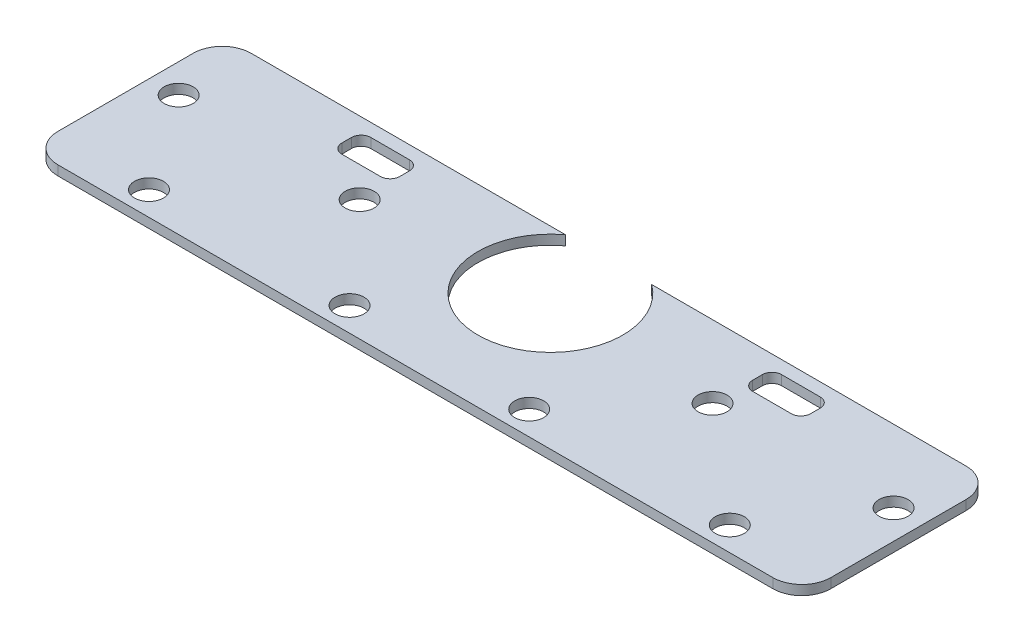
ISO-10303-21;
HEADER;
FILE_DESCRIPTION(('STEP AP214'),'2;1');
FILE_NAME('part.step','',(''),(''),'','','');
FILE_SCHEMA(('AUTOMOTIVE_DESIGN { 1 0 10303 214 1 1 1 1 }'));
ENDSEC;
DATA;
#1=APPLICATION_CONTEXT('core data for automotive mechanical design processes');
#2=APPLICATION_PROTOCOL_DEFINITION('international standard','automotive_design',2000,#1);
#3=PRODUCT_CONTEXT('',#1,'mechanical');
#4=PRODUCT('Part','Part','',(#3));
#5=PRODUCT_RELATED_PRODUCT_CATEGORY('part','',(#4));
#6=PRODUCT_DEFINITION_FORMATION('','',#4);
#7=PRODUCT_DEFINITION_CONTEXT('part definition',#1,'design');
#8=PRODUCT_DEFINITION('design','',#6,#7);
#9=PRODUCT_DEFINITION_SHAPE('','',#8);
#10=(LENGTH_UNIT() NAMED_UNIT(*) SI_UNIT(.MILLI.,.METRE.));
#11=(NAMED_UNIT(*) PLANE_ANGLE_UNIT() SI_UNIT($,.RADIAN.));
#12=(NAMED_UNIT(*) SI_UNIT($,.STERADIAN.) SOLID_ANGLE_UNIT());
#13=UNCERTAINTY_MEASURE_WITH_UNIT(LENGTH_MEASURE(1.E-05),#10,'distance_accuracy_value','');
#14=(GEOMETRIC_REPRESENTATION_CONTEXT(3) GLOBAL_UNCERTAINTY_ASSIGNED_CONTEXT((#13)) GLOBAL_UNIT_ASSIGNED_CONTEXT((#10,
#11,#12)) REPRESENTATION_CONTEXT('',''));
#15=CARTESIAN_POINT('',(0.,0.,0.));
#16=DIRECTION('',(0.,0.,1.));
#17=DIRECTION('',(1.,0.,0.));
#18=AXIS2_PLACEMENT_3D('',#15,#16,#17);
#19=CARTESIAN_POINT('',(0.,10.,-86.4681076778909));
#20=DIRECTION('',(0.,0.,1.));
#21=DIRECTION('',(1.,0.,0.));
#22=AXIS2_PLACEMENT_3D('',#19,#20,#21);
#23=PLANE('',#22);
#24=DIRECTION('',(-1.,0.,0.));
#25=VECTOR('',#24,1.);
#26=CARTESIAN_POINT('',(0.,0.,-86.4681076778909));
#27=LINE('',#26,#25);
#28=CARTESIAN_POINT('',(232.623487933506,0.,-86.4681076778909));
#29=VERTEX_POINT('',#28);
#30=CARTESIAN_POINT('',(192.623487933506,0.,-86.4681076778909));
#31=VERTEX_POINT('',#30);
#32=EDGE_CURVE('E357',#29,#31,#27,.T.);
#33=ORIENTED_EDGE('',*,*,#32,.F.);
#34=DIRECTION('',(0.,-1.,0.));
#35=VECTOR('',#34,1.);
#36=CARTESIAN_POINT('',(232.623487933506,10.,-86.4681076778909));
#37=LINE('',#36,#35);
#38=CARTESIAN_POINT('',(232.623487933506,10.,-86.4681076778909));
#39=VERTEX_POINT('',#38);
#40=EDGE_CURVE('E11',#39,#29,#37,.T.);
#41=ORIENTED_EDGE('',*,*,#40,.F.);
#42=DIRECTION('',(-1.,0.,0.));
#43=VECTOR('',#42,1.);
#44=CARTESIAN_POINT('',(0.,10.,-86.4681076778909));
#45=LINE('',#44,#43);
#46=CARTESIAN_POINT('',(192.623487933506,10.,-86.4681076778909));
#47=VERTEX_POINT('',#46);
#48=EDGE_CURVE('E569',#39,#47,#45,.T.);
#49=ORIENTED_EDGE('',*,*,#48,.T.);
#50=DIRECTION('',(0.,-1.,0.));
#51=VECTOR('',#50,1.);
#52=CARTESIAN_POINT('',(192.623487933506,10.,-86.4681076778909));
#53=LINE('',#52,#51);
#54=EDGE_CURVE('E62',#47,#31,#53,.T.);
#55=ORIENTED_EDGE('',*,*,#54,.T.);
#56=EDGE_LOOP('',(#33,#41,#49,#55));
#57=FACE_BOUND('',#56,.T.);
#58=ADVANCED_FACE('F42',(#57),#23,.T.);
#59=CARTESIAN_POINT('',(232.623487933506,10.,-76.4681076778909));
#60=DIRECTION('',(0.,-1.,0.));
#61=DIRECTION('',(0.,0.,-1.));
#62=AXIS2_PLACEMENT_3D('',#59,#60,#61);
#63=CYLINDRICAL_SURFACE('',#62,10.);
#64=CARTESIAN_POINT('',(232.623487933506,0.,-76.4681076778909));
#65=DIRECTION('',(0.,1.,0.));
#66=DIRECTION('',(0.,0.,1.));
#67=AXIS2_PLACEMENT_3D('',#64,#65,#66);
#68=CIRCLE('',#67,10.);
#69=CARTESIAN_POINT('',(242.623487933506,0.,-76.4681076778909));
#70=VERTEX_POINT('',#69);
#71=EDGE_CURVE('E360',#29,#70,#68,.F.);
#72=ORIENTED_EDGE('',*,*,#71,.T.);
#73=DIRECTION('',(0.,-1.,0.));
#74=VECTOR('',#73,1.);
#75=CARTESIAN_POINT('',(242.623487933506,10.,-76.4681076778909));
#76=LINE('',#75,#74);
#77=CARTESIAN_POINT('',(242.623487933506,10.,-76.4681076778909));
#78=VERTEX_POINT('',#77);
#79=EDGE_CURVE('E53',#78,#70,#76,.T.);
#80=ORIENTED_EDGE('',*,*,#79,.F.);
#81=CARTESIAN_POINT('',(232.623487933506,10.,-76.4681076778909));
#82=DIRECTION('',(0.,1.,0.));
#83=DIRECTION('',(0.,0.,1.));
#84=AXIS2_PLACEMENT_3D('',#81,#82,#83);
#85=CIRCLE('',#84,10.);
#86=EDGE_CURVE('E572',#39,#78,#85,.F.);
#87=ORIENTED_EDGE('',*,*,#86,.F.);
#88=ORIENTED_EDGE('',*,*,#40,.T.);
#89=EDGE_LOOP('',(#72,#80,#87,#88));
#90=FACE_BOUND('',#89,.T.);
#91=ADVANCED_FACE('F606',(#90),#63,.F.);
#92=CARTESIAN_POINT('',(242.623487933506,10.,0.));
#93=DIRECTION('',(1.,0.,0.));
#94=DIRECTION('',(0.,0.,-1.));
#95=AXIS2_PLACEMENT_3D('',#92,#93,#94);
#96=PLANE('',#95);
#97=DIRECTION('',(0.,0.,1.));
#98=VECTOR('',#97,1.);
#99=CARTESIAN_POINT('',(242.623487933506,0.,0.));
#100=LINE('',#99,#98);
#101=CARTESIAN_POINT('',(242.623487933506,0.,-66.468107677891));
#102=VERTEX_POINT('',#101);
#103=EDGE_CURVE('E364',#70,#102,#100,.T.);
#104=ORIENTED_EDGE('',*,*,#103,.T.);
#105=DIRECTION('',(0.,-1.,0.));
#106=VECTOR('',#105,1.);
#107=CARTESIAN_POINT('',(242.623487933506,10.,-66.468107677891));
#108=LINE('',#107,#106);
#109=CARTESIAN_POINT('',(242.623487933506,10.,-66.468107677891));
#110=VERTEX_POINT('',#109);
#111=EDGE_CURVE('E396',#110,#102,#108,.T.);
#112=ORIENTED_EDGE('',*,*,#111,.F.);
#113=DIRECTION('',(0.,0.,1.));
#114=VECTOR('',#113,1.);
#115=CARTESIAN_POINT('',(242.623487933506,10.,0.));
#116=LINE('',#115,#114);
#117=EDGE_CURVE('E576',#78,#110,#116,.T.);
#118=ORIENTED_EDGE('',*,*,#117,.F.);
#119=ORIENTED_EDGE('',*,*,#79,.T.);
#120=EDGE_LOOP('',(#104,#112,#118,#119));
#121=FACE_BOUND('',#120,.T.);
#122=ADVANCED_FACE('F591',(#121),#96,.F.);
#123=CARTESIAN_POINT('',(232.623487933506,10.,-66.4681076778909));
#124=DIRECTION('',(0.,-1.,0.));
#125=DIRECTION('',(0.,0.,-1.));
#126=AXIS2_PLACEMENT_3D('',#123,#124,#125);
#127=CYLINDRICAL_SURFACE('',#126,10.);
#128=CARTESIAN_POINT('',(232.623487933506,0.,-66.4681076778909));
#129=DIRECTION('',(0.,1.,0.));
#130=DIRECTION('',(0.,0.,1.));
#131=AXIS2_PLACEMENT_3D('',#128,#129,#130);
#132=CIRCLE('',#131,10.);
#133=CARTESIAN_POINT('',(232.623487933506,0.,-56.4681076778909));
#134=VERTEX_POINT('',#133);
#135=EDGE_CURVE('E368',#134,#102,#132,.T.);
#136=ORIENTED_EDGE('',*,*,#135,.F.);
#137=DIRECTION('',(0.,-1.,0.));
#138=VECTOR('',#137,1.);
#139=CARTESIAN_POINT('',(232.623487933506,10.,-56.4681076778909));
#140=LINE('',#139,#138);
#141=CARTESIAN_POINT('',(232.623487933506,10.,-56.4681076778909));
#142=VERTEX_POINT('',#141);
#143=EDGE_CURVE('E393',#142,#134,#140,.T.);
#144=ORIENTED_EDGE('',*,*,#143,.F.);
#145=CARTESIAN_POINT('',(232.623487933506,10.,-66.4681076778909));
#146=DIRECTION('',(0.,1.,0.));
#147=DIRECTION('',(0.,0.,1.));
#148=AXIS2_PLACEMENT_3D('',#145,#146,#147);
#149=CIRCLE('',#148,10.);
#150=EDGE_CURVE('E579',#142,#110,#149,.T.);
#151=ORIENTED_EDGE('',*,*,#150,.T.);
#152=ORIENTED_EDGE('',*,*,#111,.T.);
#153=EDGE_LOOP('',(#136,#144,#151,#152));
#154=FACE_BOUND('',#153,.T.);
#155=ADVANCED_FACE('F586',(#154),#127,.F.);
#156=CARTESIAN_POINT('',(0.,10.,-56.4681076778909));
#157=DIRECTION('',(0.,0.,1.));
#158=DIRECTION('',(1.,0.,0.));
#159=AXIS2_PLACEMENT_3D('',#156,#157,#158);
#160=PLANE('',#159);
#161=DIRECTION('',(-1.,0.,0.));
#162=VECTOR('',#161,1.);
#163=CARTESIAN_POINT('',(0.,0.,-56.4681076778909));
#164=LINE('',#163,#162);
#165=CARTESIAN_POINT('',(192.623487933506,0.,-56.4681076778909));
#166=VERTEX_POINT('',#165);
#167=EDGE_CURVE('E372',#134,#166,#164,.T.);
#168=ORIENTED_EDGE('',*,*,#167,.T.);
#169=DIRECTION('',(0.,-1.,0.));
#170=VECTOR('',#169,1.);
#171=CARTESIAN_POINT('',(192.623487933506,10.,-56.4681076778909));
#172=LINE('',#171,#170);
#173=CARTESIAN_POINT('',(192.623487933506,10.,-56.4681076778909));
#174=VERTEX_POINT('',#173);
#175=EDGE_CURVE('E233',#174,#166,#172,.T.);
#176=ORIENTED_EDGE('',*,*,#175,.F.);
#177=DIRECTION('',(-1.,0.,0.));
#178=VECTOR('',#177,1.);
#179=CARTESIAN_POINT('',(0.,10.,-56.4681076778909));
#180=LINE('',#179,#178);
#181=EDGE_CURVE('E243',#142,#174,#180,.T.);
#182=ORIENTED_EDGE('',*,*,#181,.F.);
#183=ORIENTED_EDGE('',*,*,#143,.T.);
#184=EDGE_LOOP('',(#168,#176,#182,#183));
#185=FACE_BOUND('',#184,.T.);
#186=ADVANCED_FACE('F596',(#185),#160,.F.);
#187=CARTESIAN_POINT('',(192.623487933506,10.,-66.4681076778909));
#188=DIRECTION('',(0.,-1.,0.));
#189=DIRECTION('',(0.,0.,-1.));
#190=AXIS2_PLACEMENT_3D('',#187,#188,#189);
#191=CYLINDRICAL_SURFACE('',#190,10.);
#192=CARTESIAN_POINT('',(192.623487933506,0.,-66.4681076778909));
#193=DIRECTION('',(0.,1.,0.));
#194=DIRECTION('',(0.,0.,1.));
#195=AXIS2_PLACEMENT_3D('',#192,#193,#194);
#196=CIRCLE('',#195,10.);
#197=CARTESIAN_POINT('',(182.623487933506,0.,-66.4681076778909));
#198=VERTEX_POINT('',#197);
#199=EDGE_CURVE('E228',#198,#166,#196,.T.);
#200=ORIENTED_EDGE('',*,*,#199,.F.);
#201=DIRECTION('',(0.,-1.,0.));
#202=VECTOR('',#201,1.);
#203=CARTESIAN_POINT('',(182.623487933506,10.,-66.4681076778909));
#204=LINE('',#203,#202);
#205=CARTESIAN_POINT('',(182.623487933506,10.,-66.4681076778909));
#206=VERTEX_POINT('',#205);
#207=EDGE_CURVE('E223',#206,#198,#204,.T.);
#208=ORIENTED_EDGE('',*,*,#207,.F.);
#209=CARTESIAN_POINT('',(192.623487933506,10.,-66.4681076778909));
#210=DIRECTION('',(0.,1.,0.));
#211=DIRECTION('',(0.,0.,1.));
#212=AXIS2_PLACEMENT_3D('',#209,#210,#211);
#213=CIRCLE('',#212,10.);
#214=EDGE_CURVE('E226',#206,#174,#213,.T.);
#215=ORIENTED_EDGE('',*,*,#214,.T.);
#216=ORIENTED_EDGE('',*,*,#175,.T.);
#217=EDGE_LOOP('',(#200,#208,#215,#216));
#218=FACE_BOUND('',#217,.T.);
#219=ADVANCED_FACE('F225',(#218),#191,.F.);
#220=CARTESIAN_POINT('',(182.623487933506,10.,0.));
#221=DIRECTION('',(1.,0.,0.));
#222=DIRECTION('',(0.,0.,-1.));
#223=AXIS2_PLACEMENT_3D('',#220,#221,#222);
#224=PLANE('',#223);
#225=DIRECTION('',(0.,0.,1.));
#226=VECTOR('',#225,1.);
#227=CARTESIAN_POINT('',(182.623487933506,0.,0.));
#228=LINE('',#227,#226);
#229=CARTESIAN_POINT('',(182.623487933506,0.,-76.4681076778909));
#230=VERTEX_POINT('',#229);
#231=EDGE_CURVE('E378',#230,#198,#228,.T.);
#232=ORIENTED_EDGE('',*,*,#231,.F.);
#233=DIRECTION('',(0.,-1.,0.));
#234=VECTOR('',#233,1.);
#235=CARTESIAN_POINT('',(182.623487933506,10.,-76.4681076778909));
#236=LINE('',#235,#234);
#237=CARTESIAN_POINT('',(182.623487933506,10.,-76.4681076778909));
#238=VERTEX_POINT('',#237);
#239=EDGE_CURVE('E141',#238,#230,#236,.T.);
#240=ORIENTED_EDGE('',*,*,#239,.F.);
#241=DIRECTION('',(0.,0.,1.));
#242=VECTOR('',#241,1.);
#243=CARTESIAN_POINT('',(182.623487933506,10.,0.));
#244=LINE('',#243,#242);
#245=EDGE_CURVE('E240',#238,#206,#244,.T.);
#246=ORIENTED_EDGE('',*,*,#245,.T.);
#247=ORIENTED_EDGE('',*,*,#207,.T.);
#248=EDGE_LOOP('',(#232,#240,#246,#247));
#249=FACE_BOUND('',#248,.T.);
#250=ADVANCED_FACE('F247',(#249),#224,.T.);
#251=CARTESIAN_POINT('',(-232.623487933506,10.,-76.4681076778909));
#252=DIRECTION('',(0.,-1.,0.));
#253=DIRECTION('',(0.,0.,-1.));
#254=AXIS2_PLACEMENT_3D('',#251,#252,#253);
#255=CYLINDRICAL_SURFACE('',#254,10.);
#256=CARTESIAN_POINT('',(-232.623487933506,0.,-76.4681076778909));
#257=DIRECTION('',(0.,1.,0.));
#258=DIRECTION('',(0.,0.,1.));
#259=AXIS2_PLACEMENT_3D('',#256,#257,#258);
#260=CIRCLE('',#259,10.);
#261=CARTESIAN_POINT('',(-232.623487933506,0.,-86.4681076778909));
#262=VERTEX_POINT('',#261);
#263=CARTESIAN_POINT('',(-242.623487933506,0.,-76.4681076778909));
#264=VERTEX_POINT('',#263);
#265=EDGE_CURVE('E317',#262,#264,#260,.T.);
#266=ORIENTED_EDGE('',*,*,#265,.F.);
#267=DIRECTION('',(0.,-1.,0.));
#268=VECTOR('',#267,1.);
#269=CARTESIAN_POINT('',(-232.623487933506,10.,-86.4681076778909));
#270=LINE('',#269,#268);
#271=CARTESIAN_POINT('',(-232.623487933506,10.,-86.4681076778909));
#272=VERTEX_POINT('',#271);
#273=EDGE_CURVE('E388',#272,#262,#270,.T.);
#274=ORIENTED_EDGE('',*,*,#273,.F.);
#275=CARTESIAN_POINT('',(-232.623487933506,10.,-76.4681076778909));
#276=DIRECTION('',(0.,1.,0.));
#277=DIRECTION('',(0.,0.,1.));
#278=AXIS2_PLACEMENT_3D('',#275,#276,#277);
#279=CIRCLE('',#278,10.);
#280=CARTESIAN_POINT('',(-242.623487933506,10.,-76.4681076778909));
#281=VERTEX_POINT('',#280);
#282=EDGE_CURVE('E532',#272,#281,#279,.T.);
#283=ORIENTED_EDGE('',*,*,#282,.T.);
#284=DIRECTION('',(0.,-1.,0.));
#285=VECTOR('',#284,1.);
#286=CARTESIAN_POINT('',(-242.623487933506,10.,-76.4681076778909));
#287=LINE('',#286,#285);
#288=EDGE_CURVE('E402',#281,#264,#287,.T.);
#289=ORIENTED_EDGE('',*,*,#288,.T.);
#290=EDGE_LOOP('',(#266,#274,#283,#289));
#291=FACE_BOUND('',#290,.T.);
#292=ADVANCED_FACE('F651',(#291),#255,.F.);
#293=CARTESIAN_POINT('',(0.,10.,-86.4681076778909));
#294=DIRECTION('',(0.,0.,-1.));
#295=DIRECTION('',(-1.,0.,0.));
#296=AXIS2_PLACEMENT_3D('',#293,#294,#295);
#297=PLANE('',#296);
#298=DIRECTION('',(1.,0.,0.));
#299=VECTOR('',#298,1.);
#300=CARTESIAN_POINT('',(0.,0.,-86.4681076778909));
#301=LINE('',#300,#299);
#302=CARTESIAN_POINT('',(-192.623487933506,0.,-86.4681076778909));
#303=VERTEX_POINT('',#302);
#304=EDGE_CURVE('E321',#262,#303,#301,.T.);
#305=ORIENTED_EDGE('',*,*,#304,.T.);
#306=DIRECTION('',(0.,-1.,0.));
#307=VECTOR('',#306,1.);
#308=CARTESIAN_POINT('',(-192.623487933506,10.,-86.4681076778909));
#309=LINE('',#308,#307);
#310=CARTESIAN_POINT('',(-192.623487933506,10.,-86.4681076778909));
#311=VERTEX_POINT('',#310);
#312=EDGE_CURVE('E422',#311,#303,#309,.T.);
#313=ORIENTED_EDGE('',*,*,#312,.F.);
#314=DIRECTION('',(1.,0.,0.));
#315=VECTOR('',#314,1.);
#316=CARTESIAN_POINT('',(0.,10.,-86.4681076778909));
#317=LINE('',#316,#315);
#318=EDGE_CURVE('E535',#272,#311,#317,.T.);
#319=ORIENTED_EDGE('',*,*,#318,.F.);
#320=ORIENTED_EDGE('',*,*,#273,.T.);
#321=EDGE_LOOP('',(#305,#313,#319,#320));
#322=FACE_BOUND('',#321,.T.);
#323=ADVANCED_FACE('F647',(#322),#297,.F.);
#324=CARTESIAN_POINT('',(-192.623487933506,10.,-76.4681076778909));
#325=DIRECTION('',(0.,-1.,0.));
#326=DIRECTION('',(0.,0.,-1.));
#327=AXIS2_PLACEMENT_3D('',#324,#325,#326);
#328=CYLINDRICAL_SURFACE('',#327,10.);
#329=CARTESIAN_POINT('',(-192.623487933506,0.,-76.4681076778909));
#330=DIRECTION('',(0.,1.,0.));
#331=DIRECTION('',(0.,0.,1.));
#332=AXIS2_PLACEMENT_3D('',#329,#330,#331);
#333=CIRCLE('',#332,10.);
#334=CARTESIAN_POINT('',(-182.623487933506,0.,-76.4681076778909));
#335=VERTEX_POINT('',#334);
#336=EDGE_CURVE('E325',#303,#335,#333,.F.);
#337=ORIENTED_EDGE('',*,*,#336,.T.);
#338=DIRECTION('',(0.,-1.,0.));
#339=VECTOR('',#338,1.);
#340=CARTESIAN_POINT('',(-182.623487933506,10.,-76.4681076778909));
#341=LINE('',#340,#339);
#342=CARTESIAN_POINT('',(-182.623487933506,10.,-76.4681076778909));
#343=VERTEX_POINT('',#342);
#344=EDGE_CURVE('E418',#343,#335,#341,.T.);
#345=ORIENTED_EDGE('',*,*,#344,.F.);
#346=CARTESIAN_POINT('',(-192.623487933506,10.,-76.4681076778909));
#347=DIRECTION('',(0.,1.,0.));
#348=DIRECTION('',(0.,0.,1.));
#349=AXIS2_PLACEMENT_3D('',#346,#347,#348);
#350=CIRCLE('',#349,10.);
#351=EDGE_CURVE('E539',#311,#343,#350,.F.);
#352=ORIENTED_EDGE('',*,*,#351,.F.);
#353=ORIENTED_EDGE('',*,*,#312,.T.);
#354=EDGE_LOOP('',(#337,#345,#352,#353));
#355=FACE_BOUND('',#354,.T.);
#356=ADVANCED_FACE('F643',(#355),#328,.F.);
#357=CARTESIAN_POINT('',(-182.623487933506,10.,0.));
#358=DIRECTION('',(1.,0.,0.));
#359=DIRECTION('',(0.,0.,-1.));
#360=AXIS2_PLACEMENT_3D('',#357,#358,#359);
#361=PLANE('',#360);
#362=DIRECTION('',(0.,0.,1.));
#363=VECTOR('',#362,1.);
#364=CARTESIAN_POINT('',(-182.623487933506,0.,0.));
#365=LINE('',#364,#363);
#366=CARTESIAN_POINT('',(-182.623487933506,0.,-66.4681076778909));
#367=VERTEX_POINT('',#366);
#368=EDGE_CURVE('E329',#335,#367,#365,.T.);
#369=ORIENTED_EDGE('',*,*,#368,.T.);
#370=DIRECTION('',(0.,-1.,0.));
#371=VECTOR('',#370,1.);
#372=CARTESIAN_POINT('',(-182.623487933506,10.,-66.4681076778909));
#373=LINE('',#372,#371);
#374=CARTESIAN_POINT('',(-182.623487933506,10.,-66.4681076778909));
#375=VERTEX_POINT('',#374);
#376=EDGE_CURVE('E414',#375,#367,#373,.T.);
#377=ORIENTED_EDGE('',*,*,#376,.F.);
#378=DIRECTION('',(0.,0.,1.));
#379=VECTOR('',#378,1.);
#380=CARTESIAN_POINT('',(-182.623487933506,10.,0.));
#381=LINE('',#380,#379);
#382=EDGE_CURVE('E543',#343,#375,#381,.T.);
#383=ORIENTED_EDGE('',*,*,#382,.F.);
#384=ORIENTED_EDGE('',*,*,#344,.T.);
#385=EDGE_LOOP('',(#369,#377,#383,#384));
#386=FACE_BOUND('',#385,.T.);
#387=ADVANCED_FACE('F639',(#386),#361,.F.);
#388=CARTESIAN_POINT('',(-192.623487933506,10.,-66.4681076778909));
#389=DIRECTION('',(0.,-1.,0.));
#390=DIRECTION('',(0.,0.,-1.));
#391=AXIS2_PLACEMENT_3D('',#388,#389,#390);
#392=CYLINDRICAL_SURFACE('',#391,10.);
#393=CARTESIAN_POINT('',(-192.623487933506,0.,-66.4681076778909));
#394=DIRECTION('',(0.,1.,0.));
#395=DIRECTION('',(0.,0.,1.));
#396=AXIS2_PLACEMENT_3D('',#393,#394,#395);
#397=CIRCLE('',#396,10.);
#398=CARTESIAN_POINT('',(-192.623487933506,0.,-56.4681076778909));
#399=VERTEX_POINT('',#398);
#400=EDGE_CURVE('E333',#367,#399,#397,.F.);
#401=ORIENTED_EDGE('',*,*,#400,.T.);
#402=DIRECTION('',(0.,-1.,0.));
#403=VECTOR('',#402,1.);
#404=CARTESIAN_POINT('',(-192.623487933506,10.,-56.4681076778909));
#405=LINE('',#404,#403);
#406=CARTESIAN_POINT('',(-192.623487933506,10.,-56.4681076778909));
#407=VERTEX_POINT('',#406);
#408=EDGE_CURVE('E411',#407,#399,#405,.T.);
#409=ORIENTED_EDGE('',*,*,#408,.F.);
#410=CARTESIAN_POINT('',(-192.623487933506,10.,-66.4681076778909));
#411=DIRECTION('',(0.,1.,0.));
#412=DIRECTION('',(0.,0.,1.));
#413=AXIS2_PLACEMENT_3D('',#410,#411,#412);
#414=CIRCLE('',#413,10.);
#415=EDGE_CURVE('E547',#375,#407,#414,.F.);
#416=ORIENTED_EDGE('',*,*,#415,.F.);
#417=ORIENTED_EDGE('',*,*,#376,.T.);
#418=EDGE_LOOP('',(#401,#409,#416,#417));
#419=FACE_BOUND('',#418,.T.);
#420=ADVANCED_FACE('F635',(#419),#392,.F.);
#421=CARTESIAN_POINT('',(0.,10.,-56.4681076778909));
#422=DIRECTION('',(0.,0.,-1.));
#423=DIRECTION('',(-1.,0.,0.));
#424=AXIS2_PLACEMENT_3D('',#421,#422,#423);
#425=PLANE('',#424);
#426=DIRECTION('',(1.,0.,0.));
#427=VECTOR('',#426,1.);
#428=CARTESIAN_POINT('',(0.,0.,-56.4681076778909));
#429=LINE('',#428,#427);
#430=CARTESIAN_POINT('',(-232.623487933506,0.,-56.4681076778909));
#431=VERTEX_POINT('',#430);
#432=EDGE_CURVE('E337',#431,#399,#429,.T.);
#433=ORIENTED_EDGE('',*,*,#432,.F.);
#434=DIRECTION('',(0.,-1.,0.));
#435=VECTOR('',#434,1.);
#436=CARTESIAN_POINT('',(-232.623487933506,10.,-56.4681076778909));
#437=LINE('',#436,#435);
#438=CARTESIAN_POINT('',(-232.623487933506,10.,-56.4681076778909));
#439=VERTEX_POINT('',#438);
#440=EDGE_CURVE('E408',#439,#431,#437,.T.);
#441=ORIENTED_EDGE('',*,*,#440,.F.);
#442=DIRECTION('',(1.,0.,0.));
#443=VECTOR('',#442,1.);
#444=CARTESIAN_POINT('',(0.,10.,-56.4681076778909));
#445=LINE('',#444,#443);
#446=EDGE_CURVE('E550',#439,#407,#445,.T.);
#447=ORIENTED_EDGE('',*,*,#446,.T.);
#448=ORIENTED_EDGE('',*,*,#408,.T.);
#449=EDGE_LOOP('',(#433,#441,#447,#448));
#450=FACE_BOUND('',#449,.T.);
#451=ADVANCED_FACE('F631',(#450),#425,.T.);
#452=CARTESIAN_POINT('',(-232.623487933506,10.,-66.4681076778909));
#453=DIRECTION('',(0.,-1.,0.));
#454=DIRECTION('',(0.,0.,-1.));
#455=AXIS2_PLACEMENT_3D('',#452,#453,#454);
#456=CYLINDRICAL_SURFACE('',#455,10.);
#457=CARTESIAN_POINT('',(-232.623487933506,0.,-66.4681076778909));
#458=DIRECTION('',(0.,1.,0.));
#459=DIRECTION('',(0.,0.,1.));
#460=AXIS2_PLACEMENT_3D('',#457,#458,#459);
#461=CIRCLE('',#460,10.);
#462=CARTESIAN_POINT('',(-242.623487933506,0.,-66.468107677891));
#463=VERTEX_POINT('',#462);
#464=EDGE_CURVE('E341',#431,#463,#461,.F.);
#465=ORIENTED_EDGE('',*,*,#464,.T.);
#466=DIRECTION('',(0.,-1.,0.));
#467=VECTOR('',#466,1.);
#468=CARTESIAN_POINT('',(-242.623487933506,10.,-66.468107677891));
#469=LINE('',#468,#467);
#470=CARTESIAN_POINT('',(-242.623487933506,10.,-66.468107677891));
#471=VERTEX_POINT('',#470);
#472=EDGE_CURVE('E405',#471,#463,#469,.T.);
#473=ORIENTED_EDGE('',*,*,#472,.F.);
#474=CARTESIAN_POINT('',(-232.623487933506,10.,-66.4681076778909));
#475=DIRECTION('',(0.,1.,0.));
#476=DIRECTION('',(0.,0.,1.));
#477=AXIS2_PLACEMENT_3D('',#474,#475,#476);
#478=CIRCLE('',#477,10.);
#479=EDGE_CURVE('E554',#439,#471,#478,.F.);
#480=ORIENTED_EDGE('',*,*,#479,.F.);
#481=ORIENTED_EDGE('',*,*,#440,.T.);
#482=EDGE_LOOP('',(#465,#473,#480,#481));
#483=FACE_BOUND('',#482,.T.);
#484=ADVANCED_FACE('F628',(#483),#456,.F.);
#485=CARTESIAN_POINT('',(0.,10.,-39.7168436794864));
#486=DIRECTION('',(0.,-1.,0.));
#487=DIRECTION('',(0.,0.,-1.));
#488=AXIS2_PLACEMENT_3D('',#485,#486,#487);
#489=CYLINDRICAL_SURFACE('',#488,75.);
#490=CARTESIAN_POINT('',(0.,0.,-39.7168436794864));
#491=DIRECTION('',(0.,1.,0.));
#492=DIRECTION('',(0.,0.,1.));
#493=AXIS2_PLACEMENT_3D('',#490,#491,#492);
#494=CIRCLE('',#493,75.);
#495=CARTESIAN_POINT('',(-44.6199626180539,0.,-100.));
#496=VERTEX_POINT('',#495);
#497=CARTESIAN_POINT('',(44.6199626180539,0.,-100.));
#498=VERTEX_POINT('',#497);
#499=EDGE_CURVE('E280',#496,#498,#494,.T.);
#500=ORIENTED_EDGE('',*,*,#499,.F.);
#501=DIRECTION('',(0.,-1.,0.));
#502=VECTOR('',#501,1.);
#503=CARTESIAN_POINT('',(-44.6199626180539,10.,-100.));
#504=LINE('',#503,#502);
#505=CARTESIAN_POINT('',(-44.6199626180539,10.,-100.));
#506=VERTEX_POINT('',#505);
#507=EDGE_CURVE('E46',#506,#496,#504,.T.);
#508=ORIENTED_EDGE('',*,*,#507,.F.);
#509=CARTESIAN_POINT('',(0.,10.,-39.7168436794864));
#510=DIRECTION('',(0.,1.,0.));
#511=DIRECTION('',(0.,0.,1.));
#512=AXIS2_PLACEMENT_3D('',#509,#510,#511);
#513=CIRCLE('',#512,75.);
#514=CARTESIAN_POINT('',(44.6199626180539,10.,-100.));
#515=VERTEX_POINT('',#514);
#516=EDGE_CURVE('E470',#506,#515,#513,.T.);
#517=ORIENTED_EDGE('',*,*,#516,.T.);
#518=DIRECTION('',(0.,-1.,0.));
#519=VECTOR('',#518,1.);
#520=CARTESIAN_POINT('',(44.6199626180539,10.,-100.));
#521=LINE('',#520,#519);
#522=EDGE_CURVE('E252',#515,#498,#521,.T.);
#523=ORIENTED_EDGE('',*,*,#522,.T.);
#524=EDGE_LOOP('',(#500,#508,#517,#523));
#525=FACE_BOUND('',#524,.T.);
#526=ADVANCED_FACE('F467',(#525),#489,.F.);
#527=CARTESIAN_POINT('',(0.,10.,-100.));
#528=DIRECTION('',(0.,0.,1.));
#529=DIRECTION('',(1.,0.,0.));
#530=AXIS2_PLACEMENT_3D('',#527,#528,#529);
#531=PLANE('',#530);
#532=DIRECTION('',(-1.,0.,0.));
#533=VECTOR('',#532,1.);
#534=CARTESIAN_POINT('',(0.,0.,-100.));
#535=LINE('',#534,#533);
#536=CARTESIAN_POINT('',(-370.,0.,-99.9999999999999));
#537=VERTEX_POINT('',#536);
#538=EDGE_CURVE('E284',#496,#537,#535,.T.);
#539=ORIENTED_EDGE('',*,*,#538,.T.);
#540=DIRECTION('',(0.,-1.,0.));
#541=VECTOR('',#540,1.);
#542=CARTESIAN_POINT('',(-370.,10.,-99.9999999999999));
#543=LINE('',#542,#541);
#544=CARTESIAN_POINT('',(-370.,10.,-99.9999999999999));
#545=VERTEX_POINT('',#544);
#546=EDGE_CURVE('E452',#545,#537,#543,.T.);
#547=ORIENTED_EDGE('',*,*,#546,.F.);
#548=DIRECTION('',(-1.,0.,0.));
#549=VECTOR('',#548,1.);
#550=CARTESIAN_POINT('',(0.,10.,-100.));
#551=LINE('',#550,#549);
#552=EDGE_CURVE('E462',#506,#545,#551,.T.);
#553=ORIENTED_EDGE('',*,*,#552,.F.);
#554=ORIENTED_EDGE('',*,*,#507,.T.);
#555=EDGE_LOOP('',(#539,#547,#553,#554));
#556=FACE_BOUND('',#555,.T.);
#557=ADVANCED_FACE('F461',(#556),#531,.F.);
#558=CARTESIAN_POINT('',(-370.,10.,-70.));
#559=DIRECTION('',(0.,-1.,0.));
#560=DIRECTION('',(0.,0.,-1.));
#561=AXIS2_PLACEMENT_3D('',#558,#559,#560);
#562=CYLINDRICAL_SURFACE('',#561,30.);
#563=CARTESIAN_POINT('',(-370.,0.,-70.));
#564=DIRECTION('',(0.,1.,0.));
#565=DIRECTION('',(0.,0.,1.));
#566=AXIS2_PLACEMENT_3D('',#563,#564,#565);
#567=CIRCLE('',#566,30.);
#568=CARTESIAN_POINT('',(-400.,0.,-70.));
#569=VERTEX_POINT('',#568);
#570=EDGE_CURVE('E288',#569,#537,#567,.F.);
#571=ORIENTED_EDGE('',*,*,#570,.F.);
#572=DIRECTION('',(0.,-1.,0.));
#573=VECTOR('',#572,1.);
#574=CARTESIAN_POINT('',(-400.,10.,-70.));
#575=LINE('',#574,#573);
#576=CARTESIAN_POINT('',(-400.,10.,-70.));
#577=VERTEX_POINT('',#576);
#578=EDGE_CURVE('E450',#577,#569,#575,.T.);
#579=ORIENTED_EDGE('',*,*,#578,.F.);
#580=CARTESIAN_POINT('',(-370.,10.,-70.));
#581=DIRECTION('',(0.,1.,0.));
#582=DIRECTION('',(0.,0.,1.));
#583=AXIS2_PLACEMENT_3D('',#580,#581,#582);
#584=CIRCLE('',#583,30.);
#585=EDGE_CURVE('E502',#577,#545,#584,.F.);
#586=ORIENTED_EDGE('',*,*,#585,.T.);
#587=ORIENTED_EDGE('',*,*,#546,.T.);
#588=EDGE_LOOP('',(#571,#579,#586,#587));
#589=FACE_BOUND('',#588,.T.);
#590=ADVANCED_FACE('F681',(#589),#562,.T.);
#591=CARTESIAN_POINT('',(-400.,10.,1.58603289232165E-13));
#592=DIRECTION('',(-1.,0.,0.));
#593=DIRECTION('',(0.,0.,1.));
#594=AXIS2_PLACEMENT_3D('',#591,#592,#593);
#595=PLANE('',#594);
#596=DIRECTION('',(0.,0.,-1.));
#597=VECTOR('',#596,1.);
#598=CARTESIAN_POINT('',(-400.,0.,1.58603289232165E-13));
#599=LINE('',#598,#597);
#600=CARTESIAN_POINT('',(-400.,0.,70.0000000000001));
#601=VERTEX_POINT('',#600);
#602=EDGE_CURVE('E293',#601,#569,#599,.T.);
#603=ORIENTED_EDGE('',*,*,#602,.F.);
#604=DIRECTION('',(0.,-1.,0.));
#605=VECTOR('',#604,1.);
#606=CARTESIAN_POINT('',(-400.,10.,70.0000000000001));
#607=LINE('',#606,#605);
#608=CARTESIAN_POINT('',(-400.,10.,70.0000000000001));
#609=VERTEX_POINT('',#608);
#610=EDGE_CURVE('E447',#609,#601,#607,.T.);
#611=ORIENTED_EDGE('',*,*,#610,.F.);
#612=DIRECTION('',(0.,0.,-1.));
#613=VECTOR('',#612,1.);
#614=CARTESIAN_POINT('',(-400.,10.,1.58603289232165E-13));
#615=LINE('',#614,#613);
#616=EDGE_CURVE('E506',#609,#577,#615,.T.);
#617=ORIENTED_EDGE('',*,*,#616,.T.);
#618=ORIENTED_EDGE('',*,*,#578,.T.);
#619=EDGE_LOOP('',(#603,#611,#617,#618));
#620=FACE_BOUND('',#619,.T.);
#621=ADVANCED_FACE('F677',(#620),#595,.T.);
#622=CARTESIAN_POINT('',(-370.,10.,70.0000000000001));
#623=DIRECTION('',(0.,-1.,0.));
#624=DIRECTION('',(0.,0.,-1.));
#625=AXIS2_PLACEMENT_3D('',#622,#623,#624);
#626=CYLINDRICAL_SURFACE('',#625,30.);
#627=CARTESIAN_POINT('',(-370.,0.,70.0000000000001));
#628=DIRECTION('',(0.,1.,0.));
#629=DIRECTION('',(0.,0.,1.));
#630=AXIS2_PLACEMENT_3D('',#627,#628,#629);
#631=CIRCLE('',#630,30.);
#632=CARTESIAN_POINT('',(-370.,0.,100.));
#633=VERTEX_POINT('',#632);
#634=EDGE_CURVE('E297',#633,#601,#631,.F.);
#635=ORIENTED_EDGE('',*,*,#634,.F.);
#636=DIRECTION('',(0.,-1.,0.));
#637=VECTOR('',#636,1.);
#638=CARTESIAN_POINT('',(-370.,10.,100.));
#639=LINE('',#638,#637);
#640=CARTESIAN_POINT('',(-370.,10.,100.));
#641=VERTEX_POINT('',#640);
#642=EDGE_CURVE('E444',#641,#633,#639,.T.);
#643=ORIENTED_EDGE('',*,*,#642,.F.);
#644=CARTESIAN_POINT('',(-370.,10.,70.0000000000001));
#645=DIRECTION('',(0.,1.,0.));
#646=DIRECTION('',(0.,0.,1.));
#647=AXIS2_PLACEMENT_3D('',#644,#645,#646);
#648=CIRCLE('',#647,30.);
#649=EDGE_CURVE('E510',#641,#609,#648,.F.);
#650=ORIENTED_EDGE('',*,*,#649,.T.);
#651=ORIENTED_EDGE('',*,*,#610,.T.);
#652=EDGE_LOOP('',(#635,#643,#650,#651));
#653=FACE_BOUND('',#652,.T.);
#654=ADVANCED_FACE('F673',(#653),#626,.T.);
#655=CARTESIAN_POINT('',(0.,10.,100.));
#656=DIRECTION('',(0.,0.,1.));
#657=DIRECTION('',(1.,0.,0.));
#658=AXIS2_PLACEMENT_3D('',#655,#656,#657);
#659=PLANE('',#658);
#660=DIRECTION('',(-1.,0.,0.));
#661=VECTOR('',#660,1.);
#662=CARTESIAN_POINT('',(0.,0.,100.));
#663=LINE('',#662,#661);
#664=CARTESIAN_POINT('',(370.,0.,100.));
#665=VERTEX_POINT('',#664);
#666=EDGE_CURVE('E301',#665,#633,#663,.T.);
#667=ORIENTED_EDGE('',*,*,#666,.F.);
#668=DIRECTION('',(0.,-1.,0.));
#669=VECTOR('',#668,1.);
#670=CARTESIAN_POINT('',(370.,10.,100.));
#671=LINE('',#670,#669);
#672=CARTESIAN_POINT('',(370.,10.,100.));
#673=VERTEX_POINT('',#672);
#674=EDGE_CURVE('E441',#673,#665,#671,.T.);
#675=ORIENTED_EDGE('',*,*,#674,.F.);
#676=DIRECTION('',(-1.,0.,0.));
#677=VECTOR('',#676,1.);
#678=CARTESIAN_POINT('',(0.,10.,100.));
#679=LINE('',#678,#677);
#680=EDGE_CURVE('E514',#673,#641,#679,.T.);
#681=ORIENTED_EDGE('',*,*,#680,.T.);
#682=ORIENTED_EDGE('',*,*,#642,.T.);
#683=EDGE_LOOP('',(#667,#675,#681,#682));
#684=FACE_BOUND('',#683,.T.);
#685=ADVANCED_FACE('F669',(#684),#659,.T.);
#686=CARTESIAN_POINT('',(370.,10.,70.));
#687=DIRECTION('',(0.,-1.,0.));
#688=DIRECTION('',(0.,0.,-1.));
#689=AXIS2_PLACEMENT_3D('',#686,#687,#688);
#690=CYLINDRICAL_SURFACE('',#689,30.);
#691=CARTESIAN_POINT('',(370.,0.,70.));
#692=DIRECTION('',(0.,1.,0.));
#693=DIRECTION('',(0.,0.,1.));
#694=AXIS2_PLACEMENT_3D('',#691,#692,#693);
#695=CIRCLE('',#694,30.);
#696=CARTESIAN_POINT('',(400.,0.,70.));
#697=VERTEX_POINT('',#696);
#698=EDGE_CURVE('E305',#697,#665,#695,.F.);
#699=ORIENTED_EDGE('',*,*,#698,.F.);
#700=DIRECTION('',(0.,-1.,0.));
#701=VECTOR('',#700,1.);
#702=CARTESIAN_POINT('',(400.,10.,70.));
#703=LINE('',#702,#701);
#704=CARTESIAN_POINT('',(400.,10.,70.));
#705=VERTEX_POINT('',#704);
#706=EDGE_CURVE('E438',#705,#697,#703,.T.);
#707=ORIENTED_EDGE('',*,*,#706,.F.);
#708=CARTESIAN_POINT('',(370.,10.,70.));
#709=DIRECTION('',(0.,1.,0.));
#710=DIRECTION('',(0.,0.,1.));
#711=AXIS2_PLACEMENT_3D('',#708,#709,#710);
#712=CIRCLE('',#711,30.);
#713=EDGE_CURVE('E518',#705,#673,#712,.F.);
#714=ORIENTED_EDGE('',*,*,#713,.T.);
#715=ORIENTED_EDGE('',*,*,#674,.T.);
#716=EDGE_LOOP('',(#699,#707,#714,#715));
#717=FACE_BOUND('',#716,.T.);
#718=ADVANCED_FACE('F665',(#717),#690,.T.);
#719=CARTESIAN_POINT('',(400.,10.,1.58603289232165E-13));
#720=DIRECTION('',(-1.,0.,0.));
#721=DIRECTION('',(0.,0.,1.));
#722=AXIS2_PLACEMENT_3D('',#719,#720,#721);
#723=PLANE('',#722);
#724=DIRECTION('',(0.,0.,-1.));
#725=VECTOR('',#724,1.);
#726=CARTESIAN_POINT('',(400.,0.,1.58603289232165E-13));
#727=LINE('',#726,#725);
#728=CARTESIAN_POINT('',(400.,0.,-70.0000000000001));
#729=VERTEX_POINT('',#728);
#730=EDGE_CURVE('E309',#697,#729,#727,.T.);
#731=ORIENTED_EDGE('',*,*,#730,.T.);
#732=DIRECTION('',(0.,-1.,0.));
#733=VECTOR('',#732,1.);
#734=CARTESIAN_POINT('',(400.,10.,-70.0000000000001));
#735=LINE('',#734,#733);
#736=CARTESIAN_POINT('',(400.,10.,-70.0000000000001));
#737=VERTEX_POINT('',#736);
#738=EDGE_CURVE('E434',#737,#729,#735,.T.);
#739=ORIENTED_EDGE('',*,*,#738,.F.);
#740=DIRECTION('',(0.,0.,-1.));
#741=VECTOR('',#740,1.);
#742=CARTESIAN_POINT('',(400.,10.,1.58603289232165E-13));
#743=LINE('',#742,#741);
#744=EDGE_CURVE('E522',#705,#737,#743,.T.);
#745=ORIENTED_EDGE('',*,*,#744,.F.);
#746=ORIENTED_EDGE('',*,*,#706,.T.);
#747=EDGE_LOOP('',(#731,#739,#745,#746));
#748=FACE_BOUND('',#747,.T.);
#749=ADVANCED_FACE('F661',(#748),#723,.F.);
#750=CARTESIAN_POINT('',(370.,10.,-70.));
#751=DIRECTION('',(0.,-1.,0.));
#752=DIRECTION('',(0.,0.,-1.));
#753=AXIS2_PLACEMENT_3D('',#750,#751,#752);
#754=CYLINDRICAL_SURFACE('',#753,30.);
#755=CARTESIAN_POINT('',(370.,0.,-70.));
#756=DIRECTION('',(0.,1.,0.));
#757=DIRECTION('',(0.,0.,1.));
#758=AXIS2_PLACEMENT_3D('',#755,#756,#757);
#759=CIRCLE('',#758,30.);
#760=CARTESIAN_POINT('',(370.,0.,-100.));
#761=VERTEX_POINT('',#760);
#762=EDGE_CURVE('E313',#729,#761,#759,.T.);
#763=ORIENTED_EDGE('',*,*,#762,.T.);
#764=DIRECTION('',(0.,-1.,0.));
#765=VECTOR('',#764,1.);
#766=CARTESIAN_POINT('',(370.,10.,-100.));
#767=LINE('',#766,#765);
#768=CARTESIAN_POINT('',(370.,10.,-100.));
#769=VERTEX_POINT('',#768);
#770=EDGE_CURVE('E430',#769,#761,#767,.T.);
#771=ORIENTED_EDGE('',*,*,#770,.F.);
#772=CARTESIAN_POINT('',(370.,10.,-70.));
#773=DIRECTION('',(0.,1.,0.));
#774=DIRECTION('',(0.,0.,1.));
#775=AXIS2_PLACEMENT_3D('',#772,#773,#774);
#776=CIRCLE('',#775,30.);
#777=EDGE_CURVE('E526',#737,#769,#776,.T.);
#778=ORIENTED_EDGE('',*,*,#777,.F.);
#779=ORIENTED_EDGE('',*,*,#738,.T.);
#780=EDGE_LOOP('',(#763,#771,#778,#779));
#781=FACE_BOUND('',#780,.T.);
#782=ADVANCED_FACE('F619',(#781),#754,.T.);
#783=CARTESIAN_POINT('',(370.,10.,-24.9491996227489));
#784=DIRECTION('',(0.,-1.,0.));
#785=DIRECTION('',(0.,0.,-1.));
#786=AXIS2_PLACEMENT_3D('',#783,#784,#785);
#787=CYLINDRICAL_SURFACE('',#786,15.);
#788=CARTESIAN_POINT('',(370.,10.,-24.9491996227489));
#789=DIRECTION('',(0.,1.,0.));
#790=DIRECTION('',(0.,0.,1.));
#791=AXIS2_PLACEMENT_3D('',#788,#789,#790);
#792=CIRCLE('',#791,15.);
#793=CARTESIAN_POINT('',(370.,10.,-9.94919962274892));
#794=VERTEX_POINT('',#793);
#795=EDGE_CURVE('E565',#794,#794,#792,.F.);
#796=ORIENTED_EDGE('',*,*,#795,.F.);
#797=EDGE_LOOP('',(#796));
#798=FACE_BOUND('',#797,.T.);
#799=CARTESIAN_POINT('',(370.,0.,-24.9491996227489));
#800=DIRECTION('',(0.,1.,0.));
#801=DIRECTION('',(0.,0.,1.));
#802=AXIS2_PLACEMENT_3D('',#799,#800,#801);
#803=CIRCLE('',#802,15.);
#804=CARTESIAN_POINT('',(370.,0.,-9.94919962274892));
#805=VERTEX_POINT('',#804);
#806=EDGE_CURVE('E353',#805,#805,#803,.F.);
#807=ORIENTED_EDGE('',*,*,#806,.T.);
#808=EDGE_LOOP('',(#807));
#809=FACE_BOUND('',#808,.T.);
#810=ADVANCED_FACE('F615',(#798,#809),#787,.F.);
#811=CARTESIAN_POINT('',(182.623487933506,10.,-24.9491996227489));
#812=DIRECTION('',(0.,-1.,0.));
#813=DIRECTION('',(0.,0.,-1.));
#814=AXIS2_PLACEMENT_3D('',#811,#812,#813);
#815=CYLINDRICAL_SURFACE('',#814,15.);
#816=CARTESIAN_POINT('',(182.623487933506,10.,-24.9491996227489));
#817=DIRECTION('',(0.,1.,0.));
#818=DIRECTION('',(0.,0.,1.));
#819=AXIS2_PLACEMENT_3D('',#816,#817,#818);
#820=CIRCLE('',#819,15.);
#821=CARTESIAN_POINT('',(182.623487933506,10.,-9.94919962274892));
#822=VERTEX_POINT('',#821);
#823=EDGE_CURVE('E561',#822,#822,#820,.F.);
#824=ORIENTED_EDGE('',*,*,#823,.F.);
#825=EDGE_LOOP('',(#824));
#826=FACE_BOUND('',#825,.T.);
#827=CARTESIAN_POINT('',(182.623487933506,0.,-24.9491996227489));
#828=DIRECTION('',(0.,1.,0.));
#829=DIRECTION('',(0.,0.,1.));
#830=AXIS2_PLACEMENT_3D('',#827,#828,#829);
#831=CIRCLE('',#830,15.);
#832=CARTESIAN_POINT('',(182.623487933506,0.,-9.94919962274892));
#833=VERTEX_POINT('',#832);
#834=EDGE_CURVE('E349',#833,#833,#831,.F.);
#835=ORIENTED_EDGE('',*,*,#834,.T.);
#836=EDGE_LOOP('',(#835));
#837=FACE_BOUND('',#836,.T.);
#838=ADVANCED_FACE('F618',(#826,#837),#815,.F.);
#839=CARTESIAN_POINT('',(-242.623487933506,10.,0.));
#840=DIRECTION('',(1.,0.,0.));
#841=DIRECTION('',(0.,0.,-1.));
#842=AXIS2_PLACEMENT_3D('',#839,#840,#841);
#843=PLANE('',#842);
#844=DIRECTION('',(0.,0.,1.));
#845=VECTOR('',#844,1.);
#846=CARTESIAN_POINT('',(-242.623487933506,0.,0.));
#847=LINE('',#846,#845);
#848=EDGE_CURVE('E345',#264,#463,#847,.T.);
#849=ORIENTED_EDGE('',*,*,#848,.F.);
#850=ORIENTED_EDGE('',*,*,#288,.F.);
#851=DIRECTION('',(0.,0.,1.));
#852=VECTOR('',#851,1.);
#853=CARTESIAN_POINT('',(-242.623487933506,10.,0.));
#854=LINE('',#853,#852);
#855=EDGE_CURVE('E557',#281,#471,#854,.T.);
#856=ORIENTED_EDGE('',*,*,#855,.T.);
#857=ORIENTED_EDGE('',*,*,#472,.T.);
#858=EDGE_LOOP('',(#849,#850,#856,#857));
#859=FACE_BOUND('',#858,.T.);
#860=ADVANCED_FACE('F623',(#859),#843,.T.);
#861=EDGE_CURVE('E289',#761,#498,#535,.T.);
#862=ORIENTED_EDGE('',*,*,#861,.T.);
#863=ORIENTED_EDGE('',*,*,#522,.F.);
#864=EDGE_CURVE('E504',#769,#515,#551,.T.);
#865=ORIENTED_EDGE('',*,*,#864,.F.);
#866=ORIENTED_EDGE('',*,*,#770,.T.);
#867=EDGE_LOOP('',(#862,#863,#865,#866));
#868=FACE_BOUND('',#867,.T.);
#869=ADVANCED_FACE('F472',(#868),#531,.F.);
#870=CARTESIAN_POINT('',(-370.,10.,-24.9491996227489));
#871=DIRECTION('',(0.,-1.,0.));
#872=DIRECTION('',(0.,0.,-1.));
#873=AXIS2_PLACEMENT_3D('',#870,#871,#872);
#874=CYLINDRICAL_SURFACE('',#873,15.);
#875=CARTESIAN_POINT('',(-370.,10.,-24.9491996227489));
#876=DIRECTION('',(0.,1.,0.));
#877=DIRECTION('',(0.,0.,1.));
#878=AXIS2_PLACEMENT_3D('',#875,#876,#877);
#879=CIRCLE('',#878,15.);
#880=CARTESIAN_POINT('',(-370.,10.,-9.94919962274892));
#881=VERTEX_POINT('',#880);
#882=EDGE_CURVE('E494',#881,#881,#879,.T.);
#883=ORIENTED_EDGE('',*,*,#882,.T.);
#884=EDGE_LOOP('',(#883));
#885=FACE_BOUND('',#884,.T.);
#886=CARTESIAN_POINT('',(-370.,0.,-24.9491996227489));
#887=DIRECTION('',(0.,1.,0.));
#888=DIRECTION('',(0.,0.,1.));
#889=AXIS2_PLACEMENT_3D('',#886,#887,#888);
#890=CIRCLE('',#889,15.);
#891=CARTESIAN_POINT('',(-370.,0.,-9.94919962274892));
#892=VERTEX_POINT('',#891);
#893=EDGE_CURVE('E276',#892,#892,#890,.T.);
#894=ORIENTED_EDGE('',*,*,#893,.F.);
#895=EDGE_LOOP('',(#894));
#896=FACE_BOUND('',#895,.T.);
#897=ADVANCED_FACE('F658',(#885,#896),#874,.F.);
#898=CARTESIAN_POINT('',(-92.9795503809705,10.,75.1545400999883));
#899=DIRECTION('',(0.,-1.,0.));
#900=DIRECTION('',(0.,0.,-1.));
#901=AXIS2_PLACEMENT_3D('',#898,#899,#900);
#902=CYLINDRICAL_SURFACE('',#901,15.);
#903=CARTESIAN_POINT('',(-92.9795503809705,10.,75.1545400999883));
#904=DIRECTION('',(0.,1.,0.));
#905=DIRECTION('',(0.,0.,1.));
#906=AXIS2_PLACEMENT_3D('',#903,#904,#905);
#907=CIRCLE('',#906,15.);
#908=CARTESIAN_POINT('',(-92.9795503809705,10.,90.1545400999884));
#909=VERTEX_POINT('',#908);
#910=EDGE_CURVE('E490',#909,#909,#907,.T.);
#911=ORIENTED_EDGE('',*,*,#910,.T.);
#912=EDGE_LOOP('',(#911));
#913=FACE_BOUND('',#912,.T.);
#914=CARTESIAN_POINT('',(-92.9795503809705,0.,75.1545400999883));
#915=DIRECTION('',(0.,1.,0.));
#916=DIRECTION('',(0.,0.,1.));
#917=AXIS2_PLACEMENT_3D('',#914,#915,#916);
#918=CIRCLE('',#917,15.);
#919=CARTESIAN_POINT('',(-92.9795503809705,0.,90.1545400999884));
#920=VERTEX_POINT('',#919);
#921=EDGE_CURVE('E272',#920,#920,#918,.T.);
#922=ORIENTED_EDGE('',*,*,#921,.F.);
#923=EDGE_LOOP('',(#922));
#924=FACE_BOUND('',#923,.T.);
#925=ADVANCED_FACE('F689',(#913,#924),#902,.F.);
#926=CARTESIAN_POINT('',(-182.623487933506,10.,-24.9491996227489));
#927=DIRECTION('',(0.,-1.,0.));
#928=DIRECTION('',(0.,0.,-1.));
#929=AXIS2_PLACEMENT_3D('',#926,#927,#928);
#930=CYLINDRICAL_SURFACE('',#929,15.);
#931=CARTESIAN_POINT('',(-182.623487933506,10.,-24.9491996227489));
#932=DIRECTION('',(0.,1.,0.));
#933=DIRECTION('',(0.,0.,1.));
#934=AXIS2_PLACEMENT_3D('',#931,#932,#933);
#935=CIRCLE('',#934,15.);
#936=CARTESIAN_POINT('',(-182.623487933506,10.,-9.94919962274892));
#937=VERTEX_POINT('',#936);
#938=EDGE_CURVE('E486',#937,#937,#935,.T.);
#939=ORIENTED_EDGE('',*,*,#938,.T.);
#940=EDGE_LOOP('',(#939));
#941=FACE_BOUND('',#940,.T.);
#942=CARTESIAN_POINT('',(-182.623487933506,0.,-24.9491996227489));
#943=DIRECTION('',(0.,1.,0.));
#944=DIRECTION('',(0.,0.,1.));
#945=AXIS2_PLACEMENT_3D('',#942,#943,#944);
#946=CIRCLE('',#945,15.);
#947=CARTESIAN_POINT('',(-182.623487933506,0.,-9.94919962274892));
#948=VERTEX_POINT('',#947);
#949=EDGE_CURVE('E268',#948,#948,#946,.T.);
#950=ORIENTED_EDGE('',*,*,#949,.F.);
#951=EDGE_LOOP('',(#950));
#952=FACE_BOUND('',#951,.T.);
#953=ADVANCED_FACE('F693',(#941,#952),#930,.F.);
#954=CARTESIAN_POINT('',(-300.618160399953,10.,75.1545400999883));
#955=DIRECTION('',(0.,-1.,0.));
#956=DIRECTION('',(0.,0.,-1.));
#957=AXIS2_PLACEMENT_3D('',#954,#955,#956);
#958=CYLINDRICAL_SURFACE('',#957,15.);
#959=CARTESIAN_POINT('',(-300.618160399953,10.,75.1545400999883));
#960=DIRECTION('',(0.,1.,0.));
#961=DIRECTION('',(0.,0.,1.));
#962=AXIS2_PLACEMENT_3D('',#959,#960,#961);
#963=CIRCLE('',#962,15.);
#964=CARTESIAN_POINT('',(-300.618160399953,10.,90.1545400999884));
#965=VERTEX_POINT('',#964);
#966=EDGE_CURVE('E482',#965,#965,#963,.T.);
#967=ORIENTED_EDGE('',*,*,#966,.T.);
#968=EDGE_LOOP('',(#967));
#969=FACE_BOUND('',#968,.T.);
#970=CARTESIAN_POINT('',(-300.618160399953,0.,75.1545400999883));
#971=DIRECTION('',(0.,1.,0.));
#972=DIRECTION('',(0.,0.,1.));
#973=AXIS2_PLACEMENT_3D('',#970,#971,#972);
#974=CIRCLE('',#973,15.);
#975=CARTESIAN_POINT('',(-300.618160399953,0.,90.1545400999884));
#976=VERTEX_POINT('',#975);
#977=EDGE_CURVE('E264',#976,#976,#974,.T.);
#978=ORIENTED_EDGE('',*,*,#977,.F.);
#979=EDGE_LOOP('',(#978));
#980=FACE_BOUND('',#979,.T.);
#981=ADVANCED_FACE('F697',(#969,#980),#958,.F.);
#982=CARTESIAN_POINT('',(92.9795503809707,10.,75.1545400999883));
#983=DIRECTION('',(0.,-1.,0.));
#984=DIRECTION('',(0.,0.,-1.));
#985=AXIS2_PLACEMENT_3D('',#982,#983,#984);
#986=CYLINDRICAL_SURFACE('',#985,15.);
#987=CARTESIAN_POINT('',(92.9795503809707,10.,75.1545400999883));
#988=DIRECTION('',(0.,1.,0.));
#989=DIRECTION('',(0.,0.,1.));
#990=AXIS2_PLACEMENT_3D('',#987,#988,#989);
#991=CIRCLE('',#990,15.);
#992=CARTESIAN_POINT('',(92.9795503809707,10.,90.1545400999884));
#993=VERTEX_POINT('',#992);
#994=EDGE_CURVE('E478',#993,#993,#991,.F.);
#995=ORIENTED_EDGE('',*,*,#994,.F.);
#996=EDGE_LOOP('',(#995));
#997=FACE_BOUND('',#996,.T.);
#998=CARTESIAN_POINT('',(92.9795503809707,0.,75.1545400999883));
#999=DIRECTION('',(0.,1.,0.));
#1000=DIRECTION('',(0.,0.,1.));
#1001=AXIS2_PLACEMENT_3D('',#998,#999,#1000);
#1002=CIRCLE('',#1001,15.);
#1003=CARTESIAN_POINT('',(92.9795503809707,0.,90.1545400999884));
#1004=VERTEX_POINT('',#1003);
#1005=EDGE_CURVE('E260',#1004,#1004,#1002,.F.);
#1006=ORIENTED_EDGE('',*,*,#1005,.T.);
#1007=EDGE_LOOP('',(#1006));
#1008=FACE_BOUND('',#1007,.T.);
#1009=ADVANCED_FACE('F700',(#997,#1008),#986,.F.);
#1010=CARTESIAN_POINT('',(300.618160399953,10.,75.1545400999883));
#1011=DIRECTION('',(0.,-1.,0.));
#1012=DIRECTION('',(0.,0.,-1.));
#1013=AXIS2_PLACEMENT_3D('',#1010,#1011,#1012);
#1014=CYLINDRICAL_SURFACE('',#1013,15.);
#1015=CARTESIAN_POINT('',(300.618160399953,10.,75.1545400999883));
#1016=DIRECTION('',(0.,1.,0.));
#1017=DIRECTION('',(0.,0.,1.));
#1018=AXIS2_PLACEMENT_3D('',#1015,#1016,#1017);
#1019=CIRCLE('',#1018,15.);
#1020=CARTESIAN_POINT('',(300.618160399953,10.,90.1545400999884));
#1021=VERTEX_POINT('',#1020);
#1022=EDGE_CURVE('E385',#1021,#1021,#1019,.F.);
#1023=ORIENTED_EDGE('',*,*,#1022,.F.);
#1024=EDGE_LOOP('',(#1023));
#1025=FACE_BOUND('',#1024,.T.);
#1026=CARTESIAN_POINT('',(300.618160399953,0.,75.1545400999883));
#1027=DIRECTION('',(0.,1.,0.));
#1028=DIRECTION('',(0.,0.,1.));
#1029=AXIS2_PLACEMENT_3D('',#1026,#1027,#1028);
#1030=CIRCLE('',#1029,15.);
#1031=CARTESIAN_POINT('',(300.618160399953,0.,90.1545400999884));
#1032=VERTEX_POINT('',#1031);
#1033=EDGE_CURVE('E256',#1032,#1032,#1030,.F.);
#1034=ORIENTED_EDGE('',*,*,#1033,.T.);
#1035=EDGE_LOOP('',(#1034));
#1036=FACE_BOUND('',#1035,.T.);
#1037=ADVANCED_FACE('F44',(#1025,#1036),#1014,.F.);
#1038=CARTESIAN_POINT('',(192.623487933506,10.,-76.4681076778909));
#1039=DIRECTION('',(0.,-1.,0.));
#1040=DIRECTION('',(0.,0.,-1.));
#1041=AXIS2_PLACEMENT_3D('',#1038,#1039,#1040);
#1042=CYLINDRICAL_SURFACE('',#1041,10.);
#1043=CARTESIAN_POINT('',(192.623487933506,0.,-76.4681076778909));
#1044=DIRECTION('',(0.,1.,0.));
#1045=DIRECTION('',(0.,0.,1.));
#1046=AXIS2_PLACEMENT_3D('',#1043,#1044,#1045);
#1047=CIRCLE('',#1046,10.);
#1048=EDGE_CURVE('E381',#31,#230,#1047,.T.);
#1049=ORIENTED_EDGE('',*,*,#1048,.F.);
#1050=ORIENTED_EDGE('',*,*,#54,.F.);
#1051=CARTESIAN_POINT('',(192.623487933506,10.,-76.4681076778909));
#1052=DIRECTION('',(0.,1.,0.));
#1053=DIRECTION('',(0.,0.,1.));
#1054=AXIS2_PLACEMENT_3D('',#1051,#1052,#1053);
#1055=CIRCLE('',#1054,10.);
#1056=EDGE_CURVE('E249',#47,#238,#1055,.T.);
#1057=ORIENTED_EDGE('',*,*,#1056,.T.);
#1058=ORIENTED_EDGE('',*,*,#239,.T.);
#1059=EDGE_LOOP('',(#1049,#1050,#1057,#1058));
#1060=FACE_BOUND('',#1059,.T.);
#1061=ADVANCED_FACE('F707',(#1060),#1042,.F.);
#1062=CARTESIAN_POINT('',(0.,10.,0.));
#1063=DIRECTION('',(0.,1.,0.));
#1064=DIRECTION('',(0.,0.,1.));
#1065=AXIS2_PLACEMENT_3D('',#1062,#1063,#1064);
#1066=PLANE('',#1065);
#1067=ORIENTED_EDGE('',*,*,#1022,.T.);
#1068=EDGE_LOOP('',(#1067));
#1069=FACE_BOUND('',#1068,.T.);
#1070=ORIENTED_EDGE('',*,*,#994,.T.);
#1071=EDGE_LOOP('',(#1070));
#1072=FACE_BOUND('',#1071,.T.);
#1073=ORIENTED_EDGE('',*,*,#966,.F.);
#1074=EDGE_LOOP('',(#1073));
#1075=FACE_BOUND('',#1074,.T.);
#1076=ORIENTED_EDGE('',*,*,#938,.F.);
#1077=EDGE_LOOP('',(#1076));
#1078=FACE_BOUND('',#1077,.T.);
#1079=ORIENTED_EDGE('',*,*,#910,.F.);
#1080=EDGE_LOOP('',(#1079));
#1081=FACE_BOUND('',#1080,.T.);
#1082=ORIENTED_EDGE('',*,*,#882,.F.);
#1083=EDGE_LOOP('',(#1082));
#1084=FACE_BOUND('',#1083,.T.);
#1085=ORIENTED_EDGE('',*,*,#516,.F.);
#1086=ORIENTED_EDGE('',*,*,#552,.T.);
#1087=ORIENTED_EDGE('',*,*,#585,.F.);
#1088=ORIENTED_EDGE('',*,*,#616,.F.);
#1089=ORIENTED_EDGE('',*,*,#649,.F.);
#1090=ORIENTED_EDGE('',*,*,#680,.F.);
#1091=ORIENTED_EDGE('',*,*,#713,.F.);
#1092=ORIENTED_EDGE('',*,*,#744,.T.);
#1093=ORIENTED_EDGE('',*,*,#777,.T.);
#1094=ORIENTED_EDGE('',*,*,#864,.T.);
#1095=EDGE_LOOP('',(#1085,#1086,#1087,#1088,#1089,#1090,#1091,#1092,#1093,#1094));
#1096=FACE_BOUND('',#1095,.T.);
#1097=ORIENTED_EDGE('',*,*,#282,.F.);
#1098=ORIENTED_EDGE('',*,*,#318,.T.);
#1099=ORIENTED_EDGE('',*,*,#351,.T.);
#1100=ORIENTED_EDGE('',*,*,#382,.T.);
#1101=ORIENTED_EDGE('',*,*,#415,.T.);
#1102=ORIENTED_EDGE('',*,*,#446,.F.);
#1103=ORIENTED_EDGE('',*,*,#479,.T.);
#1104=ORIENTED_EDGE('',*,*,#855,.F.);
#1105=EDGE_LOOP('',(#1097,#1098,#1099,#1100,#1101,#1102,#1103,#1104));
#1106=FACE_BOUND('',#1105,.T.);
#1107=ORIENTED_EDGE('',*,*,#823,.T.);
#1108=EDGE_LOOP('',(#1107));
#1109=FACE_BOUND('',#1108,.T.);
#1110=ORIENTED_EDGE('',*,*,#795,.T.);
#1111=EDGE_LOOP('',(#1110));
#1112=FACE_BOUND('',#1111,.T.);
#1113=ORIENTED_EDGE('',*,*,#48,.F.);
#1114=ORIENTED_EDGE('',*,*,#86,.T.);
#1115=ORIENTED_EDGE('',*,*,#117,.T.);
#1116=ORIENTED_EDGE('',*,*,#150,.F.);
#1117=ORIENTED_EDGE('',*,*,#181,.T.);
#1118=ORIENTED_EDGE('',*,*,#214,.F.);
#1119=ORIENTED_EDGE('',*,*,#245,.F.);
#1120=ORIENTED_EDGE('',*,*,#1056,.F.);
#1121=EDGE_LOOP('',(#1113,#1114,#1115,#1116,#1117,#1118,#1119,#1120));
#1122=FACE_BOUND('',#1121,.T.);
#1123=ADVANCED_FACE('F238',(#1069,#1072,#1075,#1078,#1081,#1084,#1096,#1106,#1109,#1112,#1122),
#1066,.T.);
#1124=CARTESIAN_POINT('',(0.,0.,0.));
#1125=DIRECTION('',(0.,1.,0.));
#1126=DIRECTION('',(0.,0.,1.));
#1127=AXIS2_PLACEMENT_3D('',#1124,#1125,#1126);
#1128=PLANE('',#1127);
#1129=ORIENTED_EDGE('',*,*,#1033,.F.);
#1130=EDGE_LOOP('',(#1129));
#1131=FACE_BOUND('',#1130,.T.);
#1132=ORIENTED_EDGE('',*,*,#1005,.F.);
#1133=EDGE_LOOP('',(#1132));
#1134=FACE_BOUND('',#1133,.T.);
#1135=ORIENTED_EDGE('',*,*,#977,.T.);
#1136=EDGE_LOOP('',(#1135));
#1137=FACE_BOUND('',#1136,.T.);
#1138=ORIENTED_EDGE('',*,*,#949,.T.);
#1139=EDGE_LOOP('',(#1138));
#1140=FACE_BOUND('',#1139,.T.);
#1141=ORIENTED_EDGE('',*,*,#921,.T.);
#1142=EDGE_LOOP('',(#1141));
#1143=FACE_BOUND('',#1142,.T.);
#1144=ORIENTED_EDGE('',*,*,#893,.T.);
#1145=EDGE_LOOP('',(#1144));
#1146=FACE_BOUND('',#1145,.T.);
#1147=ORIENTED_EDGE('',*,*,#499,.T.);
#1148=ORIENTED_EDGE('',*,*,#861,.F.);
#1149=ORIENTED_EDGE('',*,*,#762,.F.);
#1150=ORIENTED_EDGE('',*,*,#730,.F.);
#1151=ORIENTED_EDGE('',*,*,#698,.T.);
#1152=ORIENTED_EDGE('',*,*,#666,.T.);
#1153=ORIENTED_EDGE('',*,*,#634,.T.);
#1154=ORIENTED_EDGE('',*,*,#602,.T.);
#1155=ORIENTED_EDGE('',*,*,#570,.T.);
#1156=ORIENTED_EDGE('',*,*,#538,.F.);
#1157=EDGE_LOOP('',(#1147,#1148,#1149,#1150,#1151,#1152,#1153,#1154,#1155,#1156));
#1158=FACE_BOUND('',#1157,.T.);
#1159=ORIENTED_EDGE('',*,*,#265,.T.);
#1160=ORIENTED_EDGE('',*,*,#848,.T.);
#1161=ORIENTED_EDGE('',*,*,#464,.F.);
#1162=ORIENTED_EDGE('',*,*,#432,.T.);
#1163=ORIENTED_EDGE('',*,*,#400,.F.);
#1164=ORIENTED_EDGE('',*,*,#368,.F.);
#1165=ORIENTED_EDGE('',*,*,#336,.F.);
#1166=ORIENTED_EDGE('',*,*,#304,.F.);
#1167=EDGE_LOOP('',(#1159,#1160,#1161,#1162,#1163,#1164,#1165,#1166));
#1168=FACE_BOUND('',#1167,.T.);
#1169=ORIENTED_EDGE('',*,*,#834,.F.);
#1170=EDGE_LOOP('',(#1169));
#1171=FACE_BOUND('',#1170,.T.);
#1172=ORIENTED_EDGE('',*,*,#806,.F.);
#1173=EDGE_LOOP('',(#1172));
#1174=FACE_BOUND('',#1173,.T.);
#1175=ORIENTED_EDGE('',*,*,#32,.T.);
#1176=ORIENTED_EDGE('',*,*,#1048,.T.);
#1177=ORIENTED_EDGE('',*,*,#231,.T.);
#1178=ORIENTED_EDGE('',*,*,#199,.T.);
#1179=ORIENTED_EDGE('',*,*,#167,.F.);
#1180=ORIENTED_EDGE('',*,*,#135,.T.);
#1181=ORIENTED_EDGE('',*,*,#103,.F.);
#1182=ORIENTED_EDGE('',*,*,#71,.F.);
#1183=EDGE_LOOP('',(#1175,#1176,#1177,#1178,#1179,#1180,#1181,#1182));
#1184=FACE_BOUND('',#1183,.T.);
#1185=ADVANCED_FACE('F465',(#1131,#1134,#1137,#1140,#1143,#1146,#1158,#1168,#1171,#1174,#1184),
#1128,.F.);
#1186=CLOSED_SHELL('',(#58,#91,#122,#155,#186,#219,#250,#292,#323,#356,#387,#420,#451,#484,#526,
#557,#590,#621,#654,#685,#718,#749,#782,#810,#838,#860,#869,#897,#925,#953,#981,#1009,#1037,
#1061,#1123,#1185));
#1187=MANIFOLD_SOLID_BREP('B2',#1186);
#1188=ADVANCED_BREP_SHAPE_REPRESENTATION('',(#18,#1187),#14);
#1189=SHAPE_DEFINITION_REPRESENTATION(#9,#1188);
ENDSEC;
END-ISO-10303-21;
